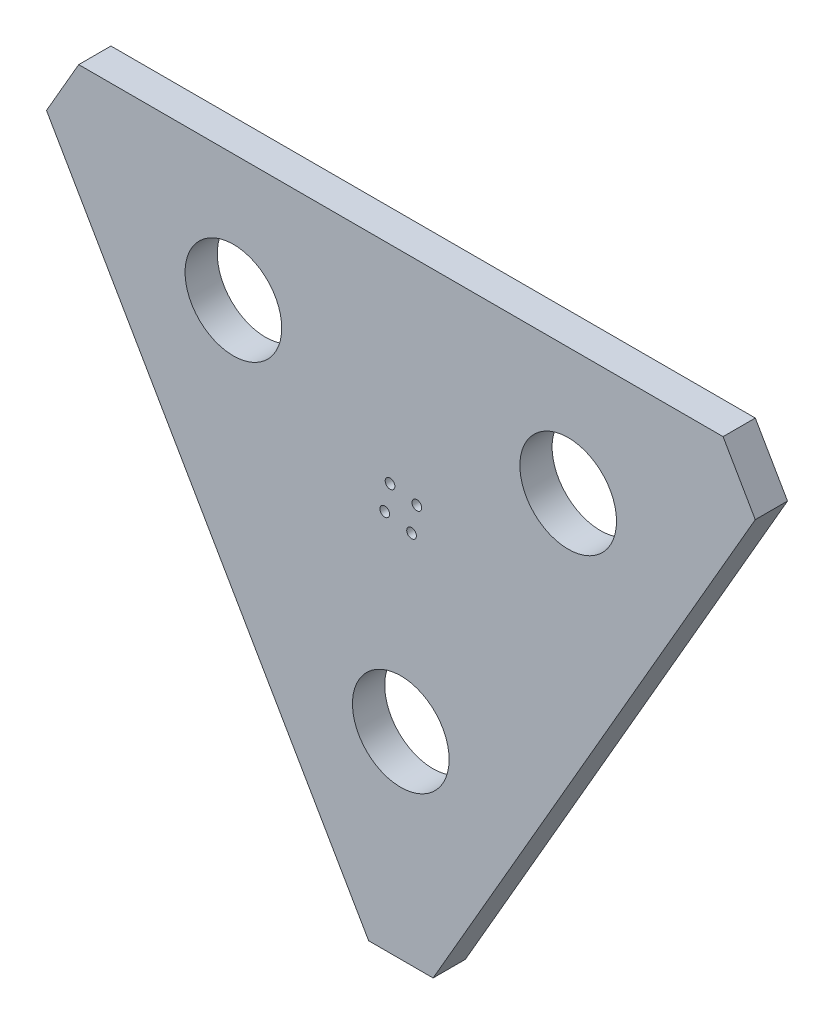
ISO-10303-21;
HEADER;
FILE_DESCRIPTION(('STEP AP214'),'2;1');
FILE_NAME('part.step','',(''),(''),'','','');
FILE_SCHEMA(('AUTOMOTIVE_DESIGN { 1 0 10303 214 1 1 1 1 }'));
ENDSEC;
DATA;
#1=APPLICATION_CONTEXT('core data for automotive mechanical design processes');
#2=APPLICATION_PROTOCOL_DEFINITION('international standard','automotive_design',2000,#1);
#3=PRODUCT_CONTEXT('',#1,'mechanical');
#4=PRODUCT('Part','Part','',(#3));
#5=PRODUCT_RELATED_PRODUCT_CATEGORY('part','',(#4));
#6=PRODUCT_DEFINITION_FORMATION('','',#4);
#7=PRODUCT_DEFINITION_CONTEXT('part definition',#1,'design');
#8=PRODUCT_DEFINITION('design','',#6,#7);
#9=PRODUCT_DEFINITION_SHAPE('','',#8);
#10=(LENGTH_UNIT() NAMED_UNIT(*) SI_UNIT(.MILLI.,.METRE.));
#11=(NAMED_UNIT(*) PLANE_ANGLE_UNIT() SI_UNIT($,.RADIAN.));
#12=(NAMED_UNIT(*) SI_UNIT($,.STERADIAN.) SOLID_ANGLE_UNIT());
#13=UNCERTAINTY_MEASURE_WITH_UNIT(LENGTH_MEASURE(1.E-05),#10,'distance_accuracy_value','');
#14=(GEOMETRIC_REPRESENTATION_CONTEXT(3) GLOBAL_UNCERTAINTY_ASSIGNED_CONTEXT((#13)) GLOBAL_UNIT_ASSIGNED_CONTEXT((#10,
#11,#12)) REPRESENTATION_CONTEXT('',''));
#15=CARTESIAN_POINT('',(0.,0.,0.));
#16=DIRECTION('',(0.,0.,1.));
#17=DIRECTION('',(1.,0.,0.));
#18=AXIS2_PLACEMENT_3D('',#15,#16,#17);
#19=CARTESIAN_POINT('',(-327.546629115536,-189.109134492007,10.));
#20=DIRECTION('',(0.866025403784441,0.499999999999995,0.));
#21=DIRECTION('',(-0.499999999999995,0.866025403784441,0.));
#22=AXIS2_PLACEMENT_3D('',#19,#20,#21);
#23=PLANE('',#22);
#24=DIRECTION('',(0.499999999999995,-0.866025403784441,0.));
#25=VECTOR('',#24,1.);
#26=CARTESIAN_POINT('',(-327.546629115536,-189.109134492007,0.));
#27=LINE('',#26,#25);
#28=CARTESIAN_POINT('',(-359.776309556902,-133.285690455852,0.));
#29=VERTEX_POINT('',#28);
#30=CARTESIAN_POINT('',(-349.776309556902,-150.606198531541,0.));
#31=VERTEX_POINT('',#30);
#32=EDGE_CURVE('E143',#29,#31,#27,.T.);
#33=ORIENTED_EDGE('',*,*,#32,.F.);
#34=DIRECTION('',(0.,0.,-1.));
#35=VECTOR('',#34,1.);
#36=CARTESIAN_POINT('',(-359.776309556902,-133.285690455852,10.));
#37=LINE('',#36,#35);
#38=CARTESIAN_POINT('',(-359.776309556902,-133.285690455852,10.));
#39=VERTEX_POINT('',#38);
#40=EDGE_CURVE('E11',#39,#29,#37,.T.);
#41=ORIENTED_EDGE('',*,*,#40,.F.);
#42=DIRECTION('',(0.499999999999995,-0.866025403784441,0.));
#43=VECTOR('',#42,1.);
#44=CARTESIAN_POINT('',(-327.546629115536,-189.109134492007,10.));
#45=LINE('',#44,#43);
#46=CARTESIAN_POINT('',(-349.776309556902,-150.606198531541,10.));
#47=VERTEX_POINT('',#46);
#48=EDGE_CURVE('E355',#39,#47,#45,.T.);
#49=ORIENTED_EDGE('',*,*,#48,.T.);
#50=DIRECTION('',(0.,0.,-1.));
#51=VECTOR('',#50,1.);
#52=CARTESIAN_POINT('',(-349.776309556902,-150.606198531541,10.));
#53=LINE('',#52,#51);
#54=EDGE_CURVE('E56',#47,#31,#53,.T.);
#55=ORIENTED_EDGE('',*,*,#54,.T.);
#56=EDGE_LOOP('',(#33,#41,#49,#55));
#57=FACE_BOUND('',#56,.T.);
#58=ADVANCED_FACE('F39',(#57),#23,.T.);
#59=CARTESIAN_POINT('',(0.,-133.285690455852,10.));
#60=DIRECTION('',(0.,1.,0.));
#61=DIRECTION('',(-1.,0.,0.));
#62=AXIS2_PLACEMENT_3D('',#59,#60,#61);
#63=PLANE('',#62);
#64=DIRECTION('',(1.,0.,0.));
#65=VECTOR('',#64,1.);
#66=CARTESIAN_POINT('',(0.,-133.285690455852,0.));
#67=LINE('',#66,#65);
#68=CARTESIAN_POINT('',(-559.776309556902,-133.285690455852,0.));
#69=VERTEX_POINT('',#68);
#70=EDGE_CURVE('E145',#69,#29,#67,.T.);
#71=ORIENTED_EDGE('',*,*,#70,.F.);
#72=DIRECTION('',(0.,0.,-1.));
#73=VECTOR('',#72,1.);
#74=CARTESIAN_POINT('',(-559.776309556902,-133.285690455852,10.));
#75=LINE('',#74,#73);
#76=CARTESIAN_POINT('',(-559.776309556902,-133.285690455852,10.));
#77=VERTEX_POINT('',#76);
#78=EDGE_CURVE('E48',#77,#69,#75,.T.);
#79=ORIENTED_EDGE('',*,*,#78,.F.);
#80=DIRECTION('',(1.,0.,0.));
#81=VECTOR('',#80,1.);
#82=CARTESIAN_POINT('',(0.,-133.285690455852,10.));
#83=LINE('',#82,#81);
#84=EDGE_CURVE('E357',#77,#39,#83,.T.);
#85=ORIENTED_EDGE('',*,*,#84,.T.);
#86=ORIENTED_EDGE('',*,*,#40,.T.);
#87=EDGE_LOOP('',(#71,#79,#85,#86));
#88=FACE_BOUND('',#87,.T.);
#89=ADVANCED_FACE('F178',(#88),#63,.T.);
#90=CARTESIAN_POINT('',(-362.117835219816,209.068829642527,10.));
#91=DIRECTION('',(-0.866025403784437,0.500000000000003,0.));
#92=DIRECTION('',(-0.500000000000003,-0.866025403784437,0.));
#93=AXIS2_PLACEMENT_3D('',#90,#91,#92);
#94=PLANE('',#93);
#95=DIRECTION('',(0.500000000000003,0.866025403784437,0.));
#96=VECTOR('',#95,1.);
#97=CARTESIAN_POINT('',(-362.117835219816,209.068829642527,0.));
#98=LINE('',#97,#96);
#99=CARTESIAN_POINT('',(-569.776309556902,-150.606198531541,0.));
#100=VERTEX_POINT('',#99);
#101=EDGE_CURVE('E148',#100,#69,#98,.T.);
#102=ORIENTED_EDGE('',*,*,#101,.F.);
#103=DIRECTION('',(0.,0.,-1.));
#104=VECTOR('',#103,1.);
#105=CARTESIAN_POINT('',(-569.776309556902,-150.606198531541,10.));
#106=LINE('',#105,#104);
#107=CARTESIAN_POINT('',(-569.776309556902,-150.606198531541,10.));
#108=VERTEX_POINT('',#107);
#109=EDGE_CURVE('E103',#108,#100,#106,.T.);
#110=ORIENTED_EDGE('',*,*,#109,.F.);
#111=DIRECTION('',(0.500000000000003,0.866025403784437,0.));
#112=VECTOR('',#111,1.);
#113=CARTESIAN_POINT('',(-362.117835219816,209.068829642527,10.));
#114=LINE('',#113,#112);
#115=EDGE_CURVE('E114',#108,#77,#114,.T.);
#116=ORIENTED_EDGE('',*,*,#115,.T.);
#117=ORIENTED_EDGE('',*,*,#78,.T.);
#118=EDGE_LOOP('',(#102,#110,#116,#117));
#119=FACE_BOUND('',#118,.T.);
#120=ADVANCED_FACE('F175',(#119),#94,.T.);
#121=CARTESIAN_POINT('',(-492.546629115537,-284.371928908294,10.));
#122=DIRECTION('',(-0.866025403784442,-0.499999999999995,0.));
#123=DIRECTION('',(0.499999999999995,-0.866025403784442,0.));
#124=AXIS2_PLACEMENT_3D('',#121,#122,#123);
#125=PLANE('',#124);
#126=DIRECTION('',(-0.499999999999995,0.866025403784442,0.));
#127=VECTOR('',#126,1.);
#128=CARTESIAN_POINT('',(-492.546629115537,-284.371928908294,0.));
#129=LINE('',#128,#127);
#130=CARTESIAN_POINT('',(-469.776309556902,-323.811279288429,0.));
#131=VERTEX_POINT('',#130);
#132=EDGE_CURVE('E99',#131,#100,#129,.T.);
#133=ORIENTED_EDGE('',*,*,#132,.F.);
#134=DIRECTION('',(0.,0.,-1.));
#135=VECTOR('',#134,1.);
#136=CARTESIAN_POINT('',(-469.776309556902,-323.811279288429,10.));
#137=LINE('',#136,#135);
#138=CARTESIAN_POINT('',(-469.776309556902,-323.811279288429,10.));
#139=VERTEX_POINT('',#138);
#140=EDGE_CURVE('E94',#139,#131,#137,.T.);
#141=ORIENTED_EDGE('',*,*,#140,.F.);
#142=DIRECTION('',(-0.499999999999995,0.866025403784442,0.));
#143=VECTOR('',#142,1.);
#144=CARTESIAN_POINT('',(-492.546629115537,-284.371928908294,10.));
#145=LINE('',#144,#143);
#146=EDGE_CURVE('E97',#139,#108,#145,.T.);
#147=ORIENTED_EDGE('',*,*,#146,.T.);
#148=ORIENTED_EDGE('',*,*,#109,.T.);
#149=EDGE_LOOP('',(#133,#141,#147,#148));
#150=FACE_BOUND('',#149,.T.);
#151=ADVANCED_FACE('F96',(#150),#125,.T.);
#152=CARTESIAN_POINT('',(9.88632529223148E-12,-323.811279288415,10.));
#153=DIRECTION('',(0.,-1.,0.));
#154=DIRECTION('',(1.,0.,0.));
#155=AXIS2_PLACEMENT_3D('',#152,#153,#154);
#156=PLANE('',#155);
#157=DIRECTION('',(-1.,0.,0.));
#158=VECTOR('',#157,1.);
#159=CARTESIAN_POINT('',(9.88632529223148E-12,-323.811279288415,0.));
#160=LINE('',#159,#158);
#161=CARTESIAN_POINT('',(-449.776309556903,-323.811279288428,0.));
#162=VERTEX_POINT('',#161);
#163=EDGE_CURVE('E152',#162,#131,#160,.T.);
#164=ORIENTED_EDGE('',*,*,#163,.F.);
#165=DIRECTION('',(0.,0.,-1.));
#166=VECTOR('',#165,1.);
#167=CARTESIAN_POINT('',(-449.776309556903,-323.811279288428,10.));
#168=LINE('',#167,#166);
#169=CARTESIAN_POINT('',(-449.776309556903,-323.811279288428,10.));
#170=VERTEX_POINT('',#169);
#171=EDGE_CURVE('E75',#170,#162,#168,.T.);
#172=ORIENTED_EDGE('',*,*,#171,.F.);
#173=DIRECTION('',(-1.,0.,0.));
#174=VECTOR('',#173,1.);
#175=CARTESIAN_POINT('',(9.88632529223148E-12,-323.811279288415,10.));
#176=LINE('',#175,#174);
#177=EDGE_CURVE('E111',#170,#139,#176,.T.);
#178=ORIENTED_EDGE('',*,*,#177,.T.);
#179=ORIENTED_EDGE('',*,*,#140,.T.);
#180=EDGE_LOOP('',(#164,#172,#178,#179));
#181=FACE_BOUND('',#180,.T.);
#182=ADVANCED_FACE('F116',(#181),#156,.T.);
#183=CARTESIAN_POINT('',(-454.824757902039,-199.244000664377,10.));
#184=DIRECTION('',(0.,0.,-1.));
#185=DIRECTION('',(-1.,0.,0.));
#186=AXIS2_PLACEMENT_3D('',#183,#184,#185);
#187=CYLINDRICAL_SURFACE('',#186,1.50000000000002);
#188=CARTESIAN_POINT('',(-454.824757902039,-199.244000664377,10.));
#189=DIRECTION('',(0.,0.,1.));
#190=DIRECTION('',(1.,0.,0.));
#191=AXIS2_PLACEMENT_3D('',#188,#189,#190);
#192=CIRCLE('',#191,1.50000000000002);
#193=CARTESIAN_POINT('',(-453.324757902039,-199.244000664377,10.));
#194=VERTEX_POINT('',#193);
#195=EDGE_CURVE('E128',#194,#194,#192,.T.);
#196=ORIENTED_EDGE('',*,*,#195,.T.);
#197=EDGE_LOOP('',(#196));
#198=FACE_BOUND('',#197,.T.);
#199=CARTESIAN_POINT('',(-454.824757902039,-199.244000664377,0.));
#200=DIRECTION('',(0.,0.,1.));
#201=DIRECTION('',(1.,0.,0.));
#202=AXIS2_PLACEMENT_3D('',#199,#200,#201);
#203=CIRCLE('',#202,1.50000000000002);
#204=CARTESIAN_POINT('',(-453.324757902039,-199.244000664377,0.));
#205=VERTEX_POINT('',#204);
#206=EDGE_CURVE('E163',#205,#205,#203,.T.);
#207=ORIENTED_EDGE('',*,*,#206,.F.);
#208=EDGE_LOOP('',(#207));
#209=FACE_BOUND('',#208,.T.);
#210=ADVANCED_FACE('F233',(#198,#209),#187,.F.);
#211=CARTESIAN_POINT('',(-456.465926698564,-207.569057119519,10.));
#212=DIRECTION('',(0.,0.,-1.));
#213=DIRECTION('',(-1.,0.,0.));
#214=AXIS2_PLACEMENT_3D('',#211,#212,#213);
#215=CYLINDRICAL_SURFACE('',#214,1.50000000000002);
#216=CARTESIAN_POINT('',(-456.465926698564,-207.569057119519,10.));
#217=DIRECTION('',(0.,0.,1.));
#218=DIRECTION('',(1.,0.,0.));
#219=AXIS2_PLACEMENT_3D('',#216,#217,#218);
#220=CIRCLE('',#219,1.50000000000002);
#221=CARTESIAN_POINT('',(-454.965926698564,-207.569057119519,10.));
#222=VERTEX_POINT('',#221);
#223=EDGE_CURVE('E125',#222,#222,#220,.T.);
#224=ORIENTED_EDGE('',*,*,#223,.T.);
#225=EDGE_LOOP('',(#224));
#226=FACE_BOUND('',#225,.T.);
#227=CARTESIAN_POINT('',(-456.465926698564,-207.569057119519,0.));
#228=DIRECTION('',(0.,0.,1.));
#229=DIRECTION('',(1.,0.,0.));
#230=AXIS2_PLACEMENT_3D('',#227,#228,#229);
#231=CIRCLE('',#230,1.50000000000002);
#232=CARTESIAN_POINT('',(-454.965926698564,-207.569057119519,0.));
#233=VERTEX_POINT('',#232);
#234=EDGE_CURVE('E160',#233,#233,#231,.T.);
#235=ORIENTED_EDGE('',*,*,#234,.F.);
#236=EDGE_LOOP('',(#235));
#237=FACE_BOUND('',#236,.T.);
#238=ADVANCED_FACE('F194',(#226,#237),#215,.F.);
#239=CARTESIAN_POINT('',(-464.790983153707,-205.927888322994,10.));
#240=DIRECTION('',(0.,0.,-1.));
#241=DIRECTION('',(-1.,0.,0.));
#242=AXIS2_PLACEMENT_3D('',#239,#240,#241);
#243=CYLINDRICAL_SURFACE('',#242,1.50000000000002);
#244=CARTESIAN_POINT('',(-464.790983153707,-205.927888322994,10.));
#245=DIRECTION('',(0.,0.,1.));
#246=DIRECTION('',(1.,0.,0.));
#247=AXIS2_PLACEMENT_3D('',#244,#245,#246);
#248=CIRCLE('',#247,1.50000000000002);
#249=CARTESIAN_POINT('',(-463.290983153707,-205.927888322994,10.));
#250=VERTEX_POINT('',#249);
#251=EDGE_CURVE('E119',#250,#250,#248,.T.);
#252=ORIENTED_EDGE('',*,*,#251,.T.);
#253=EDGE_LOOP('',(#252));
#254=FACE_BOUND('',#253,.T.);
#255=CARTESIAN_POINT('',(-464.790983153707,-205.927888322994,0.));
#256=DIRECTION('',(0.,0.,1.));
#257=DIRECTION('',(1.,0.,0.));
#258=AXIS2_PLACEMENT_3D('',#255,#256,#257);
#259=CIRCLE('',#258,1.50000000000002);
#260=CARTESIAN_POINT('',(-463.290983153707,-205.927888322994,0.));
#261=VERTEX_POINT('',#260);
#262=EDGE_CURVE('E157',#261,#261,#259,.T.);
#263=ORIENTED_EDGE('',*,*,#262,.F.);
#264=EDGE_LOOP('',(#263));
#265=FACE_BOUND('',#264,.T.);
#266=ADVANCED_FACE('F185',(#254,#265),#243,.F.);
#267=CARTESIAN_POINT('',(-197.117835219818,113.806035226238,10.));
#268=DIRECTION('',(0.866025403784438,-0.500000000000001,0.));
#269=DIRECTION('',(0.500000000000001,0.866025403784438,0.));
#270=AXIS2_PLACEMENT_3D('',#267,#268,#269);
#271=PLANE('',#270);
#272=DIRECTION('',(-0.500000000000001,-0.866025403784438,0.));
#273=VECTOR('',#272,1.);
#274=CARTESIAN_POINT('',(-197.117835219818,113.806035226238,0.));
#275=LINE('',#274,#273);
#276=EDGE_CURVE('E154',#31,#162,#275,.T.);
#277=ORIENTED_EDGE('',*,*,#276,.F.);
#278=ORIENTED_EDGE('',*,*,#54,.F.);
#279=DIRECTION('',(-0.500000000000001,-0.866025403784438,0.));
#280=VECTOR('',#279,1.);
#281=CARTESIAN_POINT('',(-197.117835219818,113.806035226238,10.));
#282=LINE('',#281,#280);
#283=EDGE_CURVE('E117',#47,#170,#282,.T.);
#284=ORIENTED_EDGE('',*,*,#283,.T.);
#285=ORIENTED_EDGE('',*,*,#171,.T.);
#286=EDGE_LOOP('',(#277,#278,#284,#285));
#287=FACE_BOUND('',#286,.T.);
#288=ADVANCED_FACE('F182',(#287),#271,.T.);
#289=CARTESIAN_POINT('',(-407.846346300803,-172.585944493692,10.));
#290=DIRECTION('',(0.,0.,-1.));
#291=DIRECTION('',(-1.,0.,0.));
#292=AXIS2_PLACEMENT_3D('',#289,#290,#291);
#293=CYLINDRICAL_SURFACE('',#292,15.);
#294=CARTESIAN_POINT('',(-407.846346300803,-172.585944493692,10.));
#295=DIRECTION('',(0.,0.,1.));
#296=DIRECTION('',(1.,0.,0.));
#297=AXIS2_PLACEMENT_3D('',#294,#295,#296);
#298=CIRCLE('',#297,15.);
#299=CARTESIAN_POINT('',(-392.846346300803,-172.585944493692,10.));
#300=VERTEX_POINT('',#299);
#301=EDGE_CURVE('E354',#300,#300,#298,.T.);
#302=ORIENTED_EDGE('',*,*,#301,.T.);
#303=EDGE_LOOP('',(#302));
#304=FACE_BOUND('',#303,.T.);
#305=CARTESIAN_POINT('',(-407.846346300803,-172.585944493692,0.));
#306=DIRECTION('',(0.,0.,1.));
#307=DIRECTION('',(1.,0.,0.));
#308=AXIS2_PLACEMENT_3D('',#305,#306,#307);
#309=CIRCLE('',#308,15.);
#310=CARTESIAN_POINT('',(-392.846346300803,-172.585944493692,0.));
#311=VERTEX_POINT('',#310);
#312=EDGE_CURVE('E140',#311,#311,#309,.T.);
#313=ORIENTED_EDGE('',*,*,#312,.F.);
#314=EDGE_LOOP('',(#313));
#315=FACE_BOUND('',#314,.T.);
#316=ADVANCED_FACE('F184',(#304,#315),#293,.F.);
#317=CARTESIAN_POINT('',(-511.769394754935,-172.585944493686,10.));
#318=DIRECTION('',(0.,0.,-1.));
#319=DIRECTION('',(-1.,0.,0.));
#320=AXIS2_PLACEMENT_3D('',#317,#318,#319);
#321=CYLINDRICAL_SURFACE('',#320,15.);
#322=CARTESIAN_POINT('',(-511.769394754935,-172.585944493686,10.));
#323=DIRECTION('',(0.,0.,1.));
#324=DIRECTION('',(1.,0.,0.));
#325=AXIS2_PLACEMENT_3D('',#322,#323,#324);
#326=CIRCLE('',#325,15.);
#327=CARTESIAN_POINT('',(-496.769394754935,-172.585944493686,10.));
#328=VERTEX_POINT('',#327);
#329=EDGE_CURVE('E215',#328,#328,#326,.T.);
#330=ORIENTED_EDGE('',*,*,#329,.T.);
#331=EDGE_LOOP('',(#330));
#332=FACE_BOUND('',#331,.T.);
#333=CARTESIAN_POINT('',(-511.769394754935,-172.585944493686,0.));
#334=DIRECTION('',(0.,0.,1.));
#335=DIRECTION('',(1.,0.,0.));
#336=AXIS2_PLACEMENT_3D('',#333,#334,#335);
#337=CIRCLE('',#336,15.);
#338=CARTESIAN_POINT('',(-496.769394754935,-172.585944493686,0.));
#339=VERTEX_POINT('',#338);
#340=EDGE_CURVE('E137',#339,#339,#337,.T.);
#341=ORIENTED_EDGE('',*,*,#340,.F.);
#342=EDGE_LOOP('',(#341));
#343=FACE_BOUND('',#342,.T.);
#344=ADVANCED_FACE('F191',(#332,#343),#321,.F.);
#345=CARTESIAN_POINT('',(-459.807870527874,-262.585944493689,10.));
#346=DIRECTION('',(0.,0.,-1.));
#347=DIRECTION('',(-1.,0.,0.));
#348=AXIS2_PLACEMENT_3D('',#345,#346,#347);
#349=CYLINDRICAL_SURFACE('',#348,15.);
#350=CARTESIAN_POINT('',(-459.807870527874,-262.585944493689,10.));
#351=DIRECTION('',(0.,0.,1.));
#352=DIRECTION('',(1.,0.,0.));
#353=AXIS2_PLACEMENT_3D('',#350,#351,#352);
#354=CIRCLE('',#353,15.);
#355=CARTESIAN_POINT('',(-444.807870527874,-262.585944493689,10.));
#356=VERTEX_POINT('',#355);
#357=EDGE_CURVE('E169',#356,#356,#354,.T.);
#358=ORIENTED_EDGE('',*,*,#357,.T.);
#359=EDGE_LOOP('',(#358));
#360=FACE_BOUND('',#359,.T.);
#361=CARTESIAN_POINT('',(-459.807870527874,-262.585944493689,0.));
#362=DIRECTION('',(0.,0.,1.));
#363=DIRECTION('',(1.,0.,0.));
#364=AXIS2_PLACEMENT_3D('',#361,#362,#363);
#365=CIRCLE('',#364,15.);
#366=CARTESIAN_POINT('',(-444.807870527874,-262.585944493689,0.));
#367=VERTEX_POINT('',#366);
#368=EDGE_CURVE('E134',#367,#367,#365,.T.);
#369=ORIENTED_EDGE('',*,*,#368,.F.);
#370=EDGE_LOOP('',(#369));
#371=FACE_BOUND('',#370,.T.);
#372=ADVANCED_FACE('F41',(#360,#371),#349,.F.);
#373=CARTESIAN_POINT('',(-463.149814357182,-197.602831867852,10.));
#374=DIRECTION('',(0.,0.,-1.));
#375=DIRECTION('',(-1.,0.,0.));
#376=AXIS2_PLACEMENT_3D('',#373,#374,#375);
#377=CYLINDRICAL_SURFACE('',#376,1.50000000000002);
#378=CARTESIAN_POINT('',(-463.149814357182,-197.602831867852,10.));
#379=DIRECTION('',(0.,0.,1.));
#380=DIRECTION('',(1.,0.,0.));
#381=AXIS2_PLACEMENT_3D('',#378,#379,#380);
#382=CIRCLE('',#381,1.50000000000002);
#383=CARTESIAN_POINT('',(-461.649814357182,-197.602831867852,10.));
#384=VERTEX_POINT('',#383);
#385=EDGE_CURVE('E131',#384,#384,#382,.T.);
#386=ORIENTED_EDGE('',*,*,#385,.T.);
#387=EDGE_LOOP('',(#386));
#388=FACE_BOUND('',#387,.T.);
#389=CARTESIAN_POINT('',(-463.149814357182,-197.602831867852,0.));
#390=DIRECTION('',(0.,0.,1.));
#391=DIRECTION('',(1.,0.,0.));
#392=AXIS2_PLACEMENT_3D('',#389,#390,#391);
#393=CIRCLE('',#392,1.50000000000002);
#394=CARTESIAN_POINT('',(-461.649814357182,-197.602831867852,0.));
#395=VERTEX_POINT('',#394);
#396=EDGE_CURVE('E166',#395,#395,#393,.T.);
#397=ORIENTED_EDGE('',*,*,#396,.F.);
#398=EDGE_LOOP('',(#397));
#399=FACE_BOUND('',#398,.T.);
#400=ADVANCED_FACE('F210',(#388,#399),#377,.F.);
#401=CARTESIAN_POINT('',(0.,0.,10.));
#402=DIRECTION('',(0.,0.,1.));
#403=DIRECTION('',(1.,0.,0.));
#404=AXIS2_PLACEMENT_3D('',#401,#402,#403);
#405=PLANE('',#404);
#406=ORIENTED_EDGE('',*,*,#357,.F.);
#407=EDGE_LOOP('',(#406));
#408=FACE_BOUND('',#407,.T.);
#409=ORIENTED_EDGE('',*,*,#329,.F.);
#410=EDGE_LOOP('',(#409));
#411=FACE_BOUND('',#410,.T.);
#412=ORIENTED_EDGE('',*,*,#301,.F.);
#413=EDGE_LOOP('',(#412));
#414=FACE_BOUND('',#413,.T.);
#415=ORIENTED_EDGE('',*,*,#48,.F.);
#416=ORIENTED_EDGE('',*,*,#84,.F.);
#417=ORIENTED_EDGE('',*,*,#115,.F.);
#418=ORIENTED_EDGE('',*,*,#146,.F.);
#419=ORIENTED_EDGE('',*,*,#177,.F.);
#420=ORIENTED_EDGE('',*,*,#283,.F.);
#421=EDGE_LOOP('',(#415,#416,#417,#418,#419,#420));
#422=FACE_BOUND('',#421,.T.);
#423=ORIENTED_EDGE('',*,*,#251,.F.);
#424=EDGE_LOOP('',(#423));
#425=FACE_BOUND('',#424,.T.);
#426=ORIENTED_EDGE('',*,*,#223,.F.);
#427=EDGE_LOOP('',(#426));
#428=FACE_BOUND('',#427,.T.);
#429=ORIENTED_EDGE('',*,*,#195,.F.);
#430=EDGE_LOOP('',(#429));
#431=FACE_BOUND('',#430,.T.);
#432=ORIENTED_EDGE('',*,*,#385,.F.);
#433=EDGE_LOOP('',(#432));
#434=FACE_BOUND('',#433,.T.);
#435=ADVANCED_FACE('F108',(#408,#411,#414,#422,#425,#428,#431,#434),#405,.T.);
#436=CARTESIAN_POINT('',(0.,0.,0.));
#437=DIRECTION('',(0.,0.,1.));
#438=DIRECTION('',(1.,0.,0.));
#439=AXIS2_PLACEMENT_3D('',#436,#437,#438);
#440=PLANE('',#439);
#441=ORIENTED_EDGE('',*,*,#368,.T.);
#442=EDGE_LOOP('',(#441));
#443=FACE_BOUND('',#442,.T.);
#444=ORIENTED_EDGE('',*,*,#340,.T.);
#445=EDGE_LOOP('',(#444));
#446=FACE_BOUND('',#445,.T.);
#447=ORIENTED_EDGE('',*,*,#312,.T.);
#448=EDGE_LOOP('',(#447));
#449=FACE_BOUND('',#448,.T.);
#450=ORIENTED_EDGE('',*,*,#32,.T.);
#451=ORIENTED_EDGE('',*,*,#276,.T.);
#452=ORIENTED_EDGE('',*,*,#163,.T.);
#453=ORIENTED_EDGE('',*,*,#132,.T.);
#454=ORIENTED_EDGE('',*,*,#101,.T.);
#455=ORIENTED_EDGE('',*,*,#70,.T.);
#456=EDGE_LOOP('',(#450,#451,#452,#453,#454,#455));
#457=FACE_BOUND('',#456,.T.);
#458=ORIENTED_EDGE('',*,*,#262,.T.);
#459=EDGE_LOOP('',(#458));
#460=FACE_BOUND('',#459,.T.);
#461=ORIENTED_EDGE('',*,*,#234,.T.);
#462=EDGE_LOOP('',(#461));
#463=FACE_BOUND('',#462,.T.);
#464=ORIENTED_EDGE('',*,*,#206,.T.);
#465=EDGE_LOOP('',(#464));
#466=FACE_BOUND('',#465,.T.);
#467=ORIENTED_EDGE('',*,*,#396,.T.);
#468=EDGE_LOOP('',(#467));
#469=FACE_BOUND('',#468,.T.);
#470=ADVANCED_FACE('F180',(#443,#446,#449,#457,#460,#463,#466,#469),#440,.F.);
#471=CLOSED_SHELL('',(#58,#89,#120,#151,#182,#210,#238,#266,#288,#316,#344,#372,#400,#435,#470));
#472=MANIFOLD_SOLID_BREP('B2',#471);
#473=ADVANCED_BREP_SHAPE_REPRESENTATION('',(#18,#472),#14);
#474=SHAPE_DEFINITION_REPRESENTATION(#9,#473);
ENDSEC;
END-ISO-10303-21;
